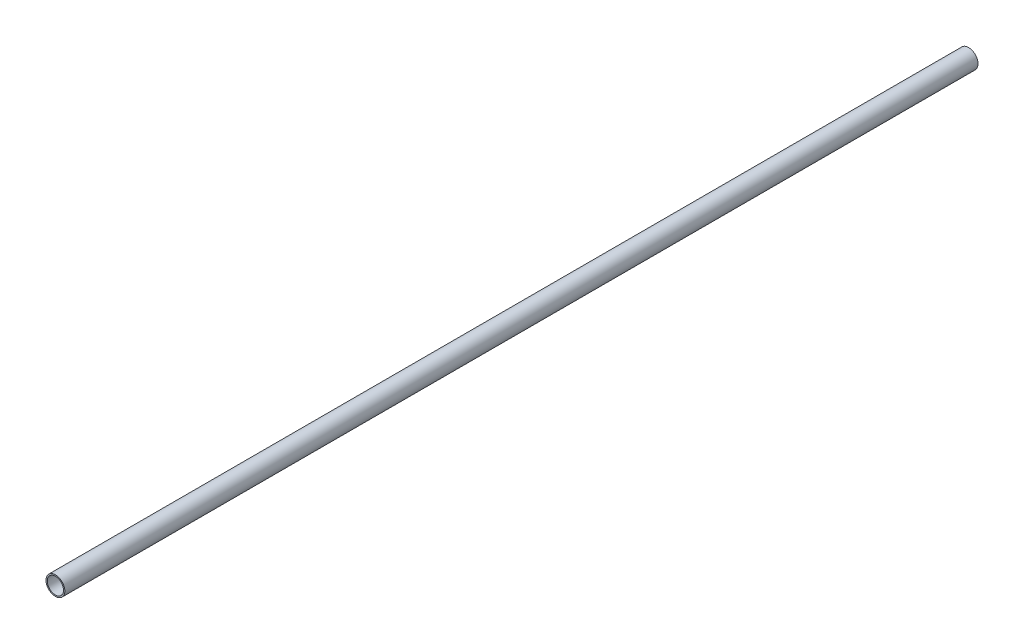
ISO-10303-21;
HEADER;
FILE_DESCRIPTION(('STEP AP214'),'2;1');
FILE_NAME('part.step','',(''),(''),'','','');
FILE_SCHEMA(('AUTOMOTIVE_DESIGN { 1 0 10303 214 1 1 1 1 }'));
ENDSEC;
DATA;
#1=APPLICATION_CONTEXT('core data for automotive mechanical design processes');
#2=APPLICATION_PROTOCOL_DEFINITION('international standard','automotive_design',2000,#1);
#3=PRODUCT_CONTEXT('',#1,'mechanical');
#4=PRODUCT('Part','Part','',(#3));
#5=PRODUCT_RELATED_PRODUCT_CATEGORY('part','',(#4));
#6=PRODUCT_DEFINITION_FORMATION('','',#4);
#7=PRODUCT_DEFINITION_CONTEXT('part definition',#1,'design');
#8=PRODUCT_DEFINITION('design','',#6,#7);
#9=PRODUCT_DEFINITION_SHAPE('','',#8);
#10=(LENGTH_UNIT() NAMED_UNIT(*) SI_UNIT(.MILLI.,.METRE.));
#11=(NAMED_UNIT(*) PLANE_ANGLE_UNIT() SI_UNIT($,.RADIAN.));
#12=(NAMED_UNIT(*) SI_UNIT($,.STERADIAN.) SOLID_ANGLE_UNIT());
#13=UNCERTAINTY_MEASURE_WITH_UNIT(LENGTH_MEASURE(1.E-05),#10,'distance_accuracy_value','');
#14=(GEOMETRIC_REPRESENTATION_CONTEXT(3) GLOBAL_UNCERTAINTY_ASSIGNED_CONTEXT((#13)) GLOBAL_UNIT_ASSIGNED_CONTEXT((#10,
#11,#12)) REPRESENTATION_CONTEXT('',''));
#15=CARTESIAN_POINT('',(0.,0.,0.));
#16=DIRECTION('',(0.,0.,1.));
#17=DIRECTION('',(1.,0.,0.));
#18=AXIS2_PLACEMENT_3D('',#15,#16,#17);
#19=CARTESIAN_POINT('',(0.,0.,703.));
#20=DIRECTION('',(0.,0.,1.));
#21=DIRECTION('',(1.,0.,0.));
#22=AXIS2_PLACEMENT_3D('',#19,#20,#21);
#23=PLANE('',#22);
#24=CARTESIAN_POINT('',(0.,0.,703.));
#25=DIRECTION('',(0.,0.,1.));
#26=DIRECTION('',(1.,0.,0.));
#27=AXIS2_PLACEMENT_3D('',#24,#25,#26);
#28=CIRCLE('',#27,7.25);
#29=CARTESIAN_POINT('',(7.25,0.,703.));
#30=VERTEX_POINT('',#29);
#31=EDGE_CURVE('E10',#30,#30,#28,.T.);
#32=ORIENTED_EDGE('',*,*,#31,.T.);
#33=EDGE_LOOP('',(#32));
#34=FACE_BOUND('',#33,.T.);
#35=CARTESIAN_POINT('',(0.,0.,703.));
#36=DIRECTION('',(0.,0.,1.));
#37=DIRECTION('',(1.,0.,0.));
#38=AXIS2_PLACEMENT_3D('',#35,#36,#37);
#39=CIRCLE('',#38,6.25);
#40=CARTESIAN_POINT('',(6.25,0.,703.));
#41=VERTEX_POINT('',#40);
#42=EDGE_CURVE('E42',#41,#41,#39,.T.);
#43=ORIENTED_EDGE('',*,*,#42,.F.);
#44=EDGE_LOOP('',(#43));
#45=FACE_BOUND('',#44,.T.);
#46=ADVANCED_FACE('F31',(#34,#45),#23,.T.);
#47=CARTESIAN_POINT('',(0.,0.,0.));
#48=DIRECTION('',(0.,0.,1.));
#49=DIRECTION('',(1.,0.,0.));
#50=AXIS2_PLACEMENT_3D('',#47,#48,#49);
#51=PLANE('',#50);
#52=CARTESIAN_POINT('',(0.,0.,0.));
#53=DIRECTION('',(0.,0.,1.));
#54=DIRECTION('',(1.,0.,0.));
#55=AXIS2_PLACEMENT_3D('',#52,#53,#54);
#56=CIRCLE('',#55,7.25);
#57=CARTESIAN_POINT('',(7.25,0.,0.));
#58=VERTEX_POINT('',#57);
#59=EDGE_CURVE('E35',#58,#58,#56,.T.);
#60=ORIENTED_EDGE('',*,*,#59,.F.);
#61=EDGE_LOOP('',(#60));
#62=FACE_BOUND('',#61,.T.);
#63=CARTESIAN_POINT('',(0.,0.,0.));
#64=DIRECTION('',(0.,0.,1.));
#65=DIRECTION('',(1.,0.,0.));
#66=AXIS2_PLACEMENT_3D('',#63,#64,#65);
#67=CIRCLE('',#66,6.25);
#68=CARTESIAN_POINT('',(6.25,0.,0.));
#69=VERTEX_POINT('',#68);
#70=EDGE_CURVE('E44',#69,#69,#67,.T.);
#71=ORIENTED_EDGE('',*,*,#70,.T.);
#72=EDGE_LOOP('',(#71));
#73=FACE_BOUND('',#72,.T.);
#74=ADVANCED_FACE('F54',(#62,#73),#51,.F.);
#75=CARTESIAN_POINT('',(0.,0.,703.));
#76=DIRECTION('',(0.,0.,-1.));
#77=DIRECTION('',(-1.,0.,0.));
#78=AXIS2_PLACEMENT_3D('',#75,#76,#77);
#79=CYLINDRICAL_SURFACE('',#78,7.25);
#80=ORIENTED_EDGE('',*,*,#31,.F.);
#81=EDGE_LOOP('',(#80));
#82=FACE_BOUND('',#81,.T.);
#83=ORIENTED_EDGE('',*,*,#59,.T.);
#84=EDGE_LOOP('',(#83));
#85=FACE_BOUND('',#84,.T.);
#86=ADVANCED_FACE('F33',(#82,#85),#79,.T.);
#87=CARTESIAN_POINT('',(0.,0.,703.));
#88=DIRECTION('',(0.,0.,-1.));
#89=DIRECTION('',(-1.,0.,0.));
#90=AXIS2_PLACEMENT_3D('',#87,#88,#89);
#91=CYLINDRICAL_SURFACE('',#90,6.25);
#92=ORIENTED_EDGE('',*,*,#42,.T.);
#93=EDGE_LOOP('',(#92));
#94=FACE_BOUND('',#93,.T.);
#95=ORIENTED_EDGE('',*,*,#70,.F.);
#96=EDGE_LOOP('',(#95));
#97=FACE_BOUND('',#96,.T.);
#98=ADVANCED_FACE('F50',(#94,#97),#91,.F.);
#99=CLOSED_SHELL('',(#46,#74,#86,#98));
#100=MANIFOLD_SOLID_BREP('B2',#99);
#101=ADVANCED_BREP_SHAPE_REPRESENTATION('',(#18,#100),#14);
#102=SHAPE_DEFINITION_REPRESENTATION(#9,#101);
ENDSEC;
END-ISO-10303-21;
